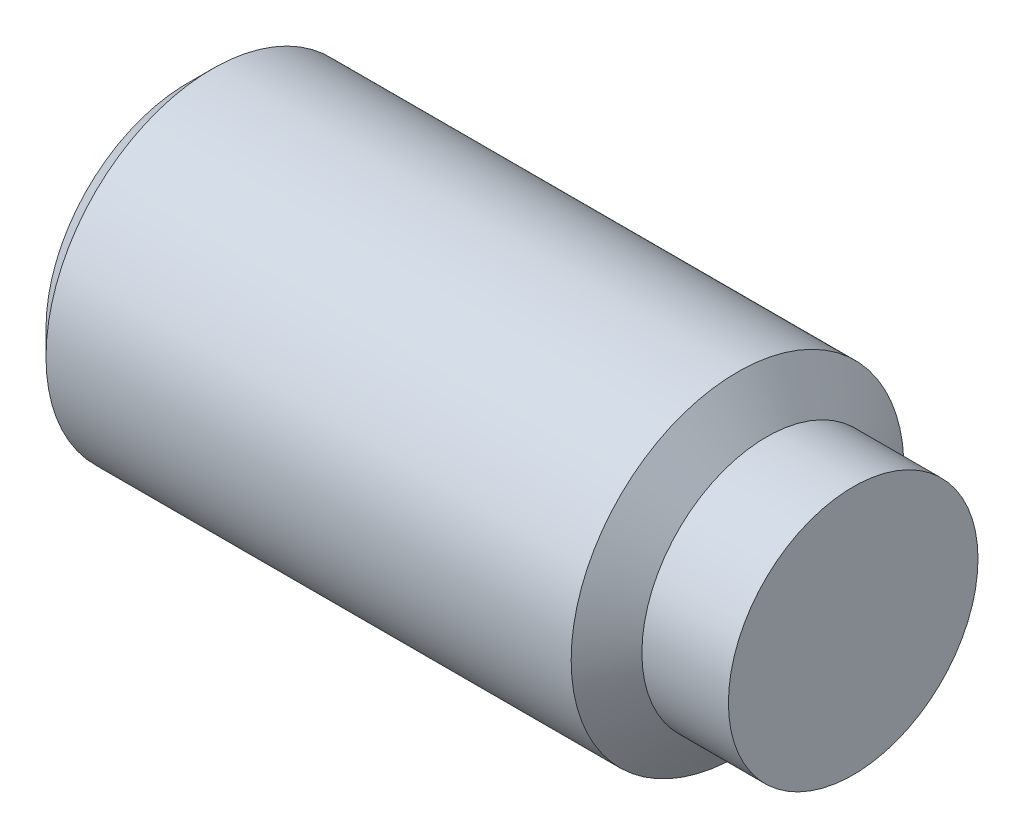
ISO-10303-21;
HEADER;
FILE_DESCRIPTION(('STEP AP214'),'2;1');
FILE_NAME('part.step','',(''),(''),'','','');
FILE_SCHEMA(('AUTOMOTIVE_DESIGN { 1 0 10303 214 1 1 1 1 }'));
ENDSEC;
DATA;
#1=APPLICATION_CONTEXT('core data for automotive mechanical design processes');
#2=APPLICATION_PROTOCOL_DEFINITION('international standard','automotive_design',2000,#1);
#3=PRODUCT_CONTEXT('',#1,'mechanical');
#4=PRODUCT('Part','Part','',(#3));
#5=PRODUCT_RELATED_PRODUCT_CATEGORY('part','',(#4));
#6=PRODUCT_DEFINITION_FORMATION('','',#4);
#7=PRODUCT_DEFINITION_CONTEXT('part definition',#1,'design');
#8=PRODUCT_DEFINITION('design','',#6,#7);
#9=PRODUCT_DEFINITION_SHAPE('','',#8);
#10=(LENGTH_UNIT() NAMED_UNIT(*) SI_UNIT(.MILLI.,.METRE.));
#11=(NAMED_UNIT(*) PLANE_ANGLE_UNIT() SI_UNIT($,.RADIAN.));
#12=(NAMED_UNIT(*) SI_UNIT($,.STERADIAN.) SOLID_ANGLE_UNIT());
#13=UNCERTAINTY_MEASURE_WITH_UNIT(LENGTH_MEASURE(1.E-05),#10,'distance_accuracy_value','');
#14=(GEOMETRIC_REPRESENTATION_CONTEXT(3) GLOBAL_UNCERTAINTY_ASSIGNED_CONTEXT((#13)) GLOBAL_UNIT_ASSIGNED_CONTEXT((#10,
#11,#12)) REPRESENTATION_CONTEXT('',''));
#15=CARTESIAN_POINT('',(0.,0.,0.));
#16=DIRECTION('',(0.,0.,1.));
#17=DIRECTION('',(1.,0.,0.));
#18=AXIS2_PLACEMENT_3D('',#15,#16,#17);
#19=CARTESIAN_POINT('',(0.,0.,0.));
#20=DIRECTION('',(-1.,0.,0.));
#21=DIRECTION('',(0.,0.,1.));
#22=AXIS2_PLACEMENT_3D('',#19,#20,#21);
#23=PLANE('',#22);
#24=CARTESIAN_POINT('',(0.,0.,0.));
#25=DIRECTION('',(-1.,0.,0.));
#26=DIRECTION('',(0.,0.,1.));
#27=AXIS2_PLACEMENT_3D('',#24,#25,#26);
#28=CIRCLE('',#27,10.81024);
#29=CARTESIAN_POINT('',(0.,0.,10.81024));
#30=VERTEX_POINT('',#29);
#31=EDGE_CURVE('E11',#30,#30,#28,.T.);
#32=ORIENTED_EDGE('',*,*,#31,.T.);
#33=EDGE_LOOP('',(#32));
#34=FACE_BOUND('',#33,.T.);
#35=DIRECTION('',(0.,0.,-1.));
#36=VECTOR('',#35,1.);
#37=CARTESIAN_POINT('',(0.,7.1374,4.12077981131403));
#38=LINE('',#37,#36);
#39=CARTESIAN_POINT('',(0.,7.1374,4.12077981131403));
#40=VERTEX_POINT('',#39);
#41=CARTESIAN_POINT('',(0.,7.1374,-4.12077981131404));
#42=VERTEX_POINT('',#41);
#43=EDGE_CURVE('E124',#40,#42,#38,.T.);
#44=ORIENTED_EDGE('',*,*,#43,.F.);
#45=DIRECTION('',(0.,-0.866025403784439,0.5));
#46=VECTOR('',#45,1.);
#47=CARTESIAN_POINT('',(0.,7.1374,4.12077981131403));
#48=LINE('',#47,#46);
#49=CARTESIAN_POINT('',(0.,0.,8.24155962262807));
#50=VERTEX_POINT('',#49);
#51=EDGE_CURVE('E46',#40,#50,#48,.T.);
#52=ORIENTED_EDGE('',*,*,#51,.T.);
#53=DIRECTION('',(0.,0.866025403784439,0.5));
#54=VECTOR('',#53,1.);
#55=CARTESIAN_POINT('',(0.,-7.13739999999999,4.12077981131404));
#56=LINE('',#55,#54);
#57=CARTESIAN_POINT('',(0.,-7.13739999999999,4.12077981131404));
#58=VERTEX_POINT('',#57);
#59=EDGE_CURVE('E115',#58,#50,#56,.T.);
#60=ORIENTED_EDGE('',*,*,#59,.F.);
#61=DIRECTION('',(0.,0.,-1.));
#62=VECTOR('',#61,1.);
#63=CARTESIAN_POINT('',(0.,-7.13739999999999,4.12077981131404));
#64=LINE('',#63,#62);
#65=CARTESIAN_POINT('',(0.,-7.13739999999999,-4.12077981131403));
#66=VERTEX_POINT('',#65);
#67=EDGE_CURVE('E118',#58,#66,#64,.T.);
#68=ORIENTED_EDGE('',*,*,#67,.T.);
#69=DIRECTION('',(0.,0.866025403784438,-0.500000000000001));
#70=VECTOR('',#69,1.);
#71=CARTESIAN_POINT('',(0.,-7.13739999999999,-4.12077981131403));
#72=LINE('',#71,#70);
#73=CARTESIAN_POINT('',(0.,0.,-8.24155962262807));
#74=VERTEX_POINT('',#73);
#75=EDGE_CURVE('E121',#66,#74,#72,.T.);
#76=ORIENTED_EDGE('',*,*,#75,.T.);
#77=DIRECTION('',(0.,-0.866025403784439,-0.5));
#78=VECTOR('',#77,1.);
#79=CARTESIAN_POINT('',(0.,7.1374,-4.12077981131404));
#80=LINE('',#79,#78);
#81=EDGE_CURVE('E104',#42,#74,#80,.T.);
#82=ORIENTED_EDGE('',*,*,#81,.F.);
#83=EDGE_LOOP('',(#44,#52,#60,#68,#76,#82));
#84=FACE_BOUND('',#83,.T.);
#85=ADVANCED_FACE('F32',(#34,#84),#23,.T.);
#86=CARTESIAN_POINT('',(0.,0.,0.));
#87=DIRECTION('',(1.,0.,0.));
#88=DIRECTION('',(0.,0.,-1.));
#89=AXIS2_PLACEMENT_3D('',#86,#87,#88);
#90=CONICAL_SURFACE('',#89,10.81024,0.785398163397449);
#91=CARTESIAN_POINT('',(1.88976,0.,0.));
#92=DIRECTION('',(-1.,0.,0.));
#93=DIRECTION('',(0.,0.,1.));
#94=AXIS2_PLACEMENT_3D('',#91,#92,#93);
#95=CIRCLE('',#94,12.7);
#96=CARTESIAN_POINT('',(1.88976,0.,12.7));
#97=VERTEX_POINT('',#96);
#98=EDGE_CURVE('E39',#97,#97,#95,.T.);
#99=ORIENTED_EDGE('',*,*,#98,.T.);
#100=EDGE_LOOP('',(#99));
#101=FACE_BOUND('',#100,.T.);
#102=ORIENTED_EDGE('',*,*,#31,.F.);
#103=EDGE_LOOP('',(#102));
#104=FACE_BOUND('',#103,.T.);
#105=ADVANCED_FACE('F144',(#101,#104),#90,.T.);
#106=CARTESIAN_POINT('',(-12.7,0.,0.));
#107=DIRECTION('',(-1.,0.,0.));
#108=DIRECTION('',(0.,0.,1.));
#109=AXIS2_PLACEMENT_3D('',#106,#107,#108);
#110=CYLINDRICAL_SURFACE('',#109,12.7);
#111=CARTESIAN_POINT('',(41.9728410661842,0.,0.));
#112=DIRECTION('',(-1.,0.,0.));
#113=DIRECTION('',(0.,0.,1.));
#114=AXIS2_PLACEMENT_3D('',#111,#112,#113);
#115=CIRCLE('',#114,12.7);
#116=CARTESIAN_POINT('',(41.9728410661842,0.,12.7));
#117=VERTEX_POINT('',#116);
#118=EDGE_CURVE('E139',#117,#117,#115,.T.);
#119=ORIENTED_EDGE('',*,*,#118,.T.);
#120=EDGE_LOOP('',(#119));
#121=FACE_BOUND('',#120,.T.);
#122=ORIENTED_EDGE('',*,*,#98,.F.);
#123=EDGE_LOOP('',(#122));
#124=FACE_BOUND('',#123,.T.);
#125=ADVANCED_FACE('F147',(#121,#124),#110,.T.);
#126=CARTESIAN_POINT('',(41.9728410661842,0.,0.));
#127=DIRECTION('',(-1.,0.,0.));
#128=DIRECTION('',(0.,0.,1.));
#129=AXIS2_PLACEMENT_3D('',#126,#127,#128);
#130=CONICAL_SURFACE('',#129,12.7,0.959931088596883);
#131=CARTESIAN_POINT('',(44.196,0.,0.));
#132=DIRECTION('',(-1.,0.,0.));
#133=DIRECTION('',(0.,0.,1.));
#134=AXIS2_PLACEMENT_3D('',#131,#132,#133);
#135=CIRCLE('',#134,9.525);
#136=CARTESIAN_POINT('',(44.196,0.,9.525));
#137=VERTEX_POINT('',#136);
#138=EDGE_CURVE('E136',#137,#137,#135,.T.);
#139=ORIENTED_EDGE('',*,*,#138,.T.);
#140=EDGE_LOOP('',(#139));
#141=FACE_BOUND('',#140,.T.);
#142=ORIENTED_EDGE('',*,*,#118,.F.);
#143=EDGE_LOOP('',(#142));
#144=FACE_BOUND('',#143,.T.);
#145=ADVANCED_FACE('F149',(#141,#144),#130,.T.);
#146=CARTESIAN_POINT('',(-12.7,0.,0.));
#147=DIRECTION('',(-1.,0.,0.));
#148=DIRECTION('',(0.,0.,1.));
#149=AXIS2_PLACEMENT_3D('',#146,#147,#148);
#150=CYLINDRICAL_SURFACE('',#149,9.525);
#151=CARTESIAN_POINT('',(50.8,0.,0.));
#152=DIRECTION('',(-1.,0.,0.));
#153=DIRECTION('',(0.,0.,1.));
#154=AXIS2_PLACEMENT_3D('',#151,#152,#153);
#155=CIRCLE('',#154,9.525);
#156=CARTESIAN_POINT('',(50.8,0.,9.525));
#157=VERTEX_POINT('',#156);
#158=EDGE_CURVE('E133',#157,#157,#155,.T.);
#159=ORIENTED_EDGE('',*,*,#158,.T.);
#160=EDGE_LOOP('',(#159));
#161=FACE_BOUND('',#160,.T.);
#162=ORIENTED_EDGE('',*,*,#138,.F.);
#163=EDGE_LOOP('',(#162));
#164=FACE_BOUND('',#163,.T.);
#165=ADVANCED_FACE('F156',(#161,#164),#150,.T.);
#166=CARTESIAN_POINT('',(50.8,9.525,0.));
#167=DIRECTION('',(1.,0.,0.));
#168=DIRECTION('',(0.,0.,-1.));
#169=AXIS2_PLACEMENT_3D('',#166,#167,#168);
#170=PLANE('',#169);
#171=ORIENTED_EDGE('',*,*,#158,.F.);
#172=EDGE_LOOP('',(#171));
#173=FACE_BOUND('',#172,.T.);
#174=ADVANCED_FACE('F191',(#173),#170,.T.);
#175=CARTESIAN_POINT('',(14.2748,7.1374,4.12077981131403));
#176=DIRECTION('',(0.,-0.5,-0.866025403784438));
#177=DIRECTION('',(0.,0.866025403784439,-0.5));
#178=AXIS2_PLACEMENT_3D('',#175,#176,#177);
#179=PLANE('',#178);
#180=ORIENTED_EDGE('',*,*,#51,.F.);
#181=DIRECTION('',(-1.,0.,0.));
#182=VECTOR('',#181,1.);
#183=CARTESIAN_POINT('',(14.2748,7.1374,4.12077981131403));
#184=LINE('',#183,#182);
#185=CARTESIAN_POINT('',(14.2748,7.1374,4.12077981131403));
#186=VERTEX_POINT('',#185);
#187=EDGE_CURVE('E51',#186,#40,#184,.T.);
#188=ORIENTED_EDGE('',*,*,#187,.F.);
#189=DIRECTION('',(0.,-0.866025403784439,0.5));
#190=VECTOR('',#189,1.);
#191=CARTESIAN_POINT('',(14.2748,7.1374,4.12077981131403));
#192=LINE('',#191,#190);
#193=CARTESIAN_POINT('',(14.2748,0.,8.24155962262807));
#194=VERTEX_POINT('',#193);
#195=EDGE_CURVE('E78',#186,#194,#192,.T.);
#196=ORIENTED_EDGE('',*,*,#195,.T.);
#197=DIRECTION('',(-1.,0.,0.));
#198=VECTOR('',#197,1.);
#199=CARTESIAN_POINT('',(14.2748,0.,8.24155962262807));
#200=LINE('',#199,#198);
#201=EDGE_CURVE('E131',#194,#50,#200,.T.);
#202=ORIENTED_EDGE('',*,*,#201,.T.);
#203=EDGE_LOOP('',(#180,#188,#196,#202));
#204=FACE_BOUND('',#203,.T.);
#205=ADVANCED_FACE('F187',(#204),#179,.T.);
#206=CARTESIAN_POINT('',(14.2748,-7.13739999999999,4.12077981131404));
#207=DIRECTION('',(0.,-0.5,0.866025403784439));
#208=DIRECTION('',(0.,-0.866025403784439,-0.5));
#209=AXIS2_PLACEMENT_3D('',#206,#207,#208);
#210=PLANE('',#209);
#211=ORIENTED_EDGE('',*,*,#59,.T.);
#212=ORIENTED_EDGE('',*,*,#201,.F.);
#213=DIRECTION('',(0.,0.866025403784439,0.5));
#214=VECTOR('',#213,1.);
#215=CARTESIAN_POINT('',(14.2748,-7.13739999999999,4.12077981131404));
#216=LINE('',#215,#214);
#217=CARTESIAN_POINT('',(14.2748,-7.13739999999999,4.12077981131404));
#218=VERTEX_POINT('',#217);
#219=EDGE_CURVE('E277',#218,#194,#216,.T.);
#220=ORIENTED_EDGE('',*,*,#219,.F.);
#221=DIRECTION('',(-1.,0.,0.));
#222=VECTOR('',#221,1.);
#223=CARTESIAN_POINT('',(14.2748,-7.13739999999999,4.12077981131404));
#224=LINE('',#223,#222);
#225=EDGE_CURVE('E129',#218,#58,#224,.T.);
#226=ORIENTED_EDGE('',*,*,#225,.T.);
#227=EDGE_LOOP('',(#211,#212,#220,#226));
#228=FACE_BOUND('',#227,.T.);
#229=ADVANCED_FACE('F183',(#228),#210,.F.);
#230=CARTESIAN_POINT('',(14.2748,-7.13739999999999,4.12077981131404));
#231=DIRECTION('',(0.,1.,0.));
#232=DIRECTION('',(0.,0.,1.));
#233=AXIS2_PLACEMENT_3D('',#230,#231,#232);
#234=PLANE('',#233);
#235=ORIENTED_EDGE('',*,*,#67,.F.);
#236=ORIENTED_EDGE('',*,*,#225,.F.);
#237=DIRECTION('',(0.,0.,-1.));
#238=VECTOR('',#237,1.);
#239=CARTESIAN_POINT('',(14.2748,-7.13739999999999,4.12077981131404));
#240=LINE('',#239,#238);
#241=CARTESIAN_POINT('',(14.2748,-7.13739999999999,-4.12077981131403));
#242=VERTEX_POINT('',#241);
#243=EDGE_CURVE('E99',#218,#242,#240,.T.);
#244=ORIENTED_EDGE('',*,*,#243,.T.);
#245=DIRECTION('',(-1.,0.,0.));
#246=VECTOR('',#245,1.);
#247=CARTESIAN_POINT('',(14.2748,-7.13739999999999,-4.12077981131403));
#248=LINE('',#247,#246);
#249=EDGE_CURVE('E94',#242,#66,#248,.T.);
#250=ORIENTED_EDGE('',*,*,#249,.T.);
#251=EDGE_LOOP('',(#235,#236,#244,#250));
#252=FACE_BOUND('',#251,.T.);
#253=ADVANCED_FACE('F180',(#252),#234,.T.);
#254=CARTESIAN_POINT('',(14.2748,-7.13739999999999,-4.12077981131403));
#255=DIRECTION('',(0.,0.500000000000001,0.866025403784438));
#256=DIRECTION('',(0.,-0.866025403784438,0.500000000000001));
#257=AXIS2_PLACEMENT_3D('',#254,#255,#256);
#258=PLANE('',#257);
#259=ORIENTED_EDGE('',*,*,#75,.F.);
#260=ORIENTED_EDGE('',*,*,#249,.F.);
#261=DIRECTION('',(0.,0.866025403784438,-0.500000000000001));
#262=VECTOR('',#261,1.);
#263=CARTESIAN_POINT('',(14.2748,-7.13739999999999,-4.12077981131403));
#264=LINE('',#263,#262);
#265=CARTESIAN_POINT('',(14.2748,0.,-8.24155962262807));
#266=VERTEX_POINT('',#265);
#267=EDGE_CURVE('E89',#242,#266,#264,.T.);
#268=ORIENTED_EDGE('',*,*,#267,.T.);
#269=DIRECTION('',(-1.,0.,0.));
#270=VECTOR('',#269,1.);
#271=CARTESIAN_POINT('',(14.2748,0.,-8.24155962262807));
#272=LINE('',#271,#270);
#273=EDGE_CURVE('E93',#266,#74,#272,.T.);
#274=ORIENTED_EDGE('',*,*,#273,.T.);
#275=EDGE_LOOP('',(#259,#260,#268,#274));
#276=FACE_BOUND('',#275,.T.);
#277=ADVANCED_FACE('F92',(#276),#258,.T.);
#278=CARTESIAN_POINT('',(14.2748,7.1374,-4.12077981131404));
#279=DIRECTION('',(0.,0.5,-0.866025403784439));
#280=DIRECTION('',(0.,0.866025403784439,0.5));
#281=AXIS2_PLACEMENT_3D('',#278,#279,#280);
#282=PLANE('',#281);
#283=ORIENTED_EDGE('',*,*,#81,.T.);
#284=ORIENTED_EDGE('',*,*,#273,.F.);
#285=DIRECTION('',(0.,-0.866025403784439,-0.5));
#286=VECTOR('',#285,1.);
#287=CARTESIAN_POINT('',(14.2748,7.1374,-4.12077981131404));
#288=LINE('',#287,#286);
#289=CARTESIAN_POINT('',(14.2748,7.1374,-4.12077981131404));
#290=VERTEX_POINT('',#289);
#291=EDGE_CURVE('E98',#290,#266,#288,.T.);
#292=ORIENTED_EDGE('',*,*,#291,.F.);
#293=DIRECTION('',(-1.,0.,0.));
#294=VECTOR('',#293,1.);
#295=CARTESIAN_POINT('',(14.2748,7.1374,-4.12077981131404));
#296=LINE('',#295,#294);
#297=EDGE_CURVE('E74',#290,#42,#296,.T.);
#298=ORIENTED_EDGE('',*,*,#297,.T.);
#299=EDGE_LOOP('',(#283,#284,#292,#298));
#300=FACE_BOUND('',#299,.T.);
#301=ADVANCED_FACE('F101',(#300),#282,.F.);
#302=CARTESIAN_POINT('',(14.2748,7.1374,4.12077981131403));
#303=DIRECTION('',(0.,1.,0.));
#304=DIRECTION('',(0.,0.,1.));
#305=AXIS2_PLACEMENT_3D('',#302,#303,#304);
#306=PLANE('',#305);
#307=ORIENTED_EDGE('',*,*,#43,.T.);
#308=ORIENTED_EDGE('',*,*,#297,.F.);
#309=DIRECTION('',(0.,0.,-1.));
#310=VECTOR('',#309,1.);
#311=CARTESIAN_POINT('',(14.2748,7.1374,4.12077981131403));
#312=LINE('',#311,#310);
#313=EDGE_CURVE('E109',#186,#290,#312,.T.);
#314=ORIENTED_EDGE('',*,*,#313,.F.);
#315=ORIENTED_EDGE('',*,*,#187,.T.);
#316=EDGE_LOOP('',(#307,#308,#314,#315));
#317=FACE_BOUND('',#316,.T.);
#318=ADVANCED_FACE('F168',(#317),#306,.F.);
#319=CARTESIAN_POINT('',(14.2748,14.2748,0.));
#320=DIRECTION('',(1.,0.,0.));
#321=DIRECTION('',(0.,0.,-1.));
#322=AXIS2_PLACEMENT_3D('',#319,#320,#321);
#323=PLANE('',#322);
#324=ORIENTED_EDGE('',*,*,#195,.F.);
#325=ORIENTED_EDGE('',*,*,#313,.T.);
#326=ORIENTED_EDGE('',*,*,#291,.T.);
#327=ORIENTED_EDGE('',*,*,#267,.F.);
#328=ORIENTED_EDGE('',*,*,#243,.F.);
#329=ORIENTED_EDGE('',*,*,#219,.T.);
#330=EDGE_LOOP('',(#324,#325,#326,#327,#328,#329));
#331=FACE_BOUND('',#330,.T.);
#332=ADVANCED_FACE('F107',(#331),#323,.F.);
#333=CLOSED_SHELL('',(#85,#105,#125,#145,#165,#174,#205,#229,#253,#277,#301,#318,#332));
#334=MANIFOLD_SOLID_BREP('B2',#333);
#335=ADVANCED_BREP_SHAPE_REPRESENTATION('',(#18,#334),#14);
#336=SHAPE_DEFINITION_REPRESENTATION(#9,#335);
ENDSEC;
END-ISO-10303-21;
